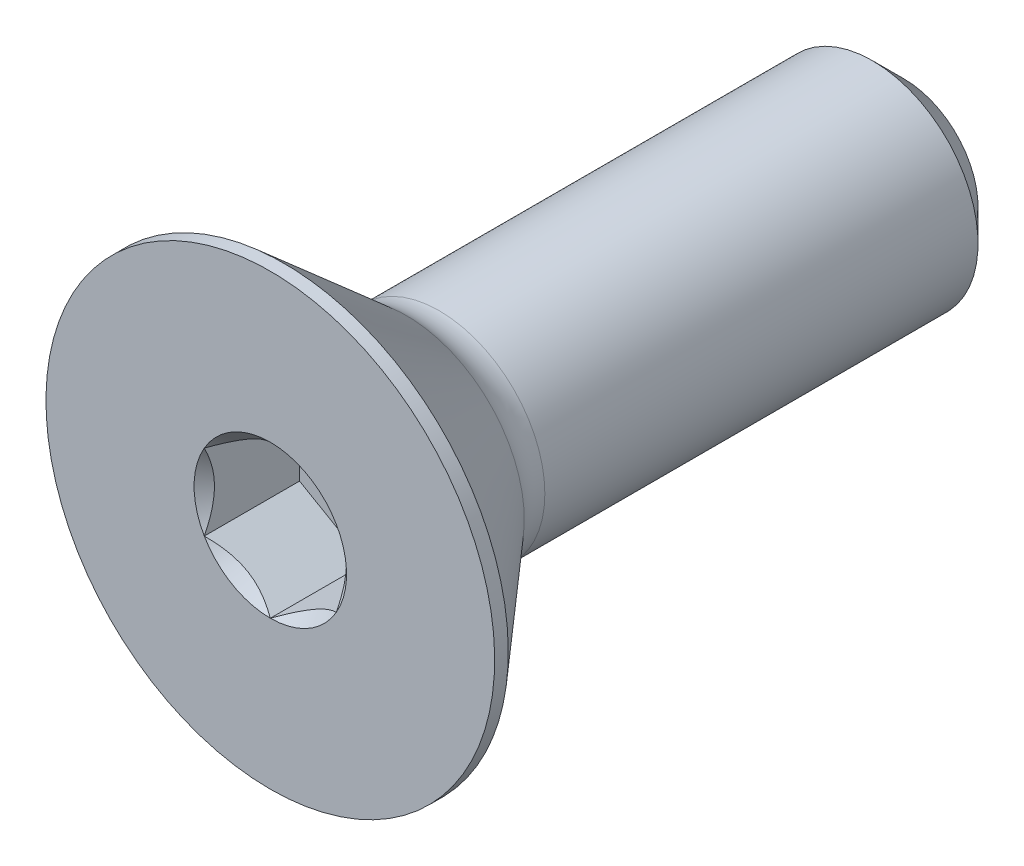
ISO-10303-21;
HEADER;
FILE_DESCRIPTION(('STEP AP214'),'2;1');
FILE_NAME('part.step','',(''),(''),'','','');
FILE_SCHEMA(('AUTOMOTIVE_DESIGN { 1 0 10303 214 1 1 1 1 }'));
ENDSEC;
DATA;
#1=APPLICATION_CONTEXT('core data for automotive mechanical design processes');
#2=APPLICATION_PROTOCOL_DEFINITION('international standard','automotive_design',2000,#1);
#3=PRODUCT_CONTEXT('',#1,'mechanical');
#4=PRODUCT('Part','Part','',(#3));
#5=PRODUCT_RELATED_PRODUCT_CATEGORY('part','',(#4));
#6=PRODUCT_DEFINITION_FORMATION('','',#4);
#7=PRODUCT_DEFINITION_CONTEXT('part definition',#1,'design');
#8=PRODUCT_DEFINITION('design','',#6,#7);
#9=PRODUCT_DEFINITION_SHAPE('','',#8);
#10=(LENGTH_UNIT() NAMED_UNIT(*) SI_UNIT(.MILLI.,.METRE.));
#11=(NAMED_UNIT(*) PLANE_ANGLE_UNIT() SI_UNIT($,.RADIAN.));
#12=(NAMED_UNIT(*) SI_UNIT($,.STERADIAN.) SOLID_ANGLE_UNIT());
#13=UNCERTAINTY_MEASURE_WITH_UNIT(LENGTH_MEASURE(1.E-05),#10,'distance_accuracy_value','');
#14=(GEOMETRIC_REPRESENTATION_CONTEXT(3) GLOBAL_UNCERTAINTY_ASSIGNED_CONTEXT((#13)) GLOBAL_UNIT_ASSIGNED_CONTEXT((#10,
#11,#12)) REPRESENTATION_CONTEXT('',''));
#15=CARTESIAN_POINT('',(0.,0.,0.));
#16=DIRECTION('',(0.,0.,1.));
#17=DIRECTION('',(1.,0.,0.));
#18=AXIS2_PLACEMENT_3D('',#15,#16,#17);
#19=CARTESIAN_POINT('',(0.,0.,0.));
#20=DIRECTION('',(0.,0.,-1.));
#21=DIRECTION('',(0.,1.,0.));
#22=AXIS2_PLACEMENT_3D('',#19,#20,#21);
#23=PLANE('',#22);
#24=CARTESIAN_POINT('',(0.,0.,0.));
#25=DIRECTION('',(0.,0.,1.));
#26=DIRECTION('',(1.,0.,0.));
#27=AXIS2_PLACEMENT_3D('',#24,#25,#26);
#28=CIRCLE('',#27,2.29135888084633);
#29=CARTESIAN_POINT('',(0.,2.29135888084633,0.));
#30=VERTEX_POINT('',#29);
#31=CARTESIAN_POINT('',(-1.984375,1.14567944042316,0.));
#32=VERTEX_POINT('',#31);
#33=EDGE_CURVE('E136',#30,#32,#28,.T.);
#34=ORIENTED_EDGE('',*,*,#33,.F.);
#35=CARTESIAN_POINT('',(1.984375,1.14567944042317,0.));
#36=VERTEX_POINT('',#35);
#37=EDGE_CURVE('E133',#36,#30,#28,.T.);
#38=ORIENTED_EDGE('',*,*,#37,.F.);
#39=CARTESIAN_POINT('',(1.984375,-1.14567944042317,0.));
#40=VERTEX_POINT('',#39);
#41=EDGE_CURVE('E104',#40,#36,#28,.T.);
#42=ORIENTED_EDGE('',*,*,#41,.F.);
#43=CARTESIAN_POINT('',(0.,-2.29135888084633,0.));
#44=VERTEX_POINT('',#43);
#45=EDGE_CURVE('E96',#44,#40,#28,.T.);
#46=ORIENTED_EDGE('',*,*,#45,.F.);
#47=CARTESIAN_POINT('',(-1.984375,-1.14567944042316,0.));
#48=VERTEX_POINT('',#47);
#49=EDGE_CURVE('E57',#48,#44,#28,.T.);
#50=ORIENTED_EDGE('',*,*,#49,.F.);
#51=EDGE_CURVE('E64',#32,#48,#28,.T.);
#52=ORIENTED_EDGE('',*,*,#51,.F.);
#53=EDGE_LOOP('',(#34,#38,#42,#46,#50,#52));
#54=FACE_BOUND('',#53,.T.);
#55=CARTESIAN_POINT('',(0.,0.,0.));
#56=DIRECTION('',(0.,0.,1.));
#57=DIRECTION('',(0.,-1.,0.));
#58=AXIS2_PLACEMENT_3D('',#55,#56,#57);
#59=CIRCLE('',#58,6.7437);
#60=CARTESIAN_POINT('',(0.,-6.7437,0.));
#61=VERTEX_POINT('',#60);
#62=EDGE_CURVE('E178',#61,#61,#59,.T.);
#63=ORIENTED_EDGE('',*,*,#62,.T.);
#64=EDGE_LOOP('',(#63));
#65=FACE_BOUND('',#64,.T.);
#66=ADVANCED_FACE('F38',(#54,#65),#23,.F.);
#67=CARTESIAN_POINT('',(0.,0.,-5.07720440387605));
#68=DIRECTION('',(0.,0.,1.));
#69=DIRECTION('',(0.,-1.,0.));
#70=AXIS2_PLACEMENT_3D('',#67,#68,#69);
#71=TOROIDAL_SURFACE('',#70,4.68066391166966,1.50566391166966);
#72=CARTESIAN_POINT('',(0.,0.,-4.0894));
#73=DIRECTION('',(0.,0.,1.));
#74=DIRECTION('',(0.,-1.,0.));
#75=AXIS2_PLACEMENT_3D('',#72,#73,#74);
#76=CIRCLE('',#75,3.54432493293688);
#77=CARTESIAN_POINT('',(0.,-3.54432493293688,-4.0894));
#78=VERTEX_POINT('',#77);
#79=EDGE_CURVE('E51',#78,#78,#76,.T.);
#80=ORIENTED_EDGE('',*,*,#79,.F.);
#81=EDGE_LOOP('',(#80));
#82=FACE_BOUND('',#81,.T.);
#83=CARTESIAN_POINT('',(0.,0.,-5.07720440387605));
#84=DIRECTION('',(0.,0.,1.));
#85=DIRECTION('',(1.,0.,0.));
#86=AXIS2_PLACEMENT_3D('',#83,#84,#85);
#87=CIRCLE('',#86,3.175);
#88=CARTESIAN_POINT('',(3.175,0.,-5.07720440387605));
#89=VERTEX_POINT('',#88);
#90=EDGE_CURVE('E175',#89,#89,#87,.F.);
#91=ORIENTED_EDGE('',*,*,#90,.F.);
#92=EDGE_LOOP('',(#91));
#93=FACE_BOUND('',#92,.T.);
#94=ADVANCED_FACE('F188',(#82,#93),#71,.F.);
#95=CARTESIAN_POINT('',(0.,0.,-4.0894));
#96=DIRECTION('',(0.,0.,1.));
#97=DIRECTION('',(0.,-1.,0.));
#98=AXIS2_PLACEMENT_3D('',#95,#96,#97);
#99=CONICAL_SURFACE('',#98,3.54432493293688,0.715584993317676);
#100=CARTESIAN_POINT('',(0.,0.,-0.408939999999995));
#101=DIRECTION('',(0.,0.,1.));
#102=DIRECTION('',(0.,-1.,0.));
#103=AXIS2_PLACEMENT_3D('',#100,#101,#102);
#104=CIRCLE('',#103,6.7437);
#105=CARTESIAN_POINT('',(0.,-6.7437,-0.408939999999991));
#106=VERTEX_POINT('',#105);
#107=EDGE_CURVE('E181',#106,#106,#104,.T.);
#108=ORIENTED_EDGE('',*,*,#107,.F.);
#109=EDGE_LOOP('',(#108));
#110=FACE_BOUND('',#109,.T.);
#111=ORIENTED_EDGE('',*,*,#79,.T.);
#112=EDGE_LOOP('',(#111));
#113=FACE_BOUND('',#112,.T.);
#114=ADVANCED_FACE('F186',(#110,#113),#99,.T.);
#115=CARTESIAN_POINT('',(0.,0.,0.));
#116=DIRECTION('',(0.,0.,1.));
#117=DIRECTION('',(0.,-1.,0.));
#118=AXIS2_PLACEMENT_3D('',#115,#116,#117);
#119=CYLINDRICAL_SURFACE('',#118,6.7437);
#120=ORIENTED_EDGE('',*,*,#62,.F.);
#121=EDGE_LOOP('',(#120));
#122=FACE_BOUND('',#121,.T.);
#123=ORIENTED_EDGE('',*,*,#107,.T.);
#124=EDGE_LOOP('',(#123));
#125=FACE_BOUND('',#124,.T.);
#126=ADVANCED_FACE('F207',(#122,#125),#119,.T.);
#127=CARTESIAN_POINT('',(0.,-3.175,-19.05));
#128=DIRECTION('',(0.,0.,-1.));
#129=DIRECTION('',(0.,1.,0.));
#130=AXIS2_PLACEMENT_3D('',#127,#128,#129);
#131=PLANE('',#130);
#132=CARTESIAN_POINT('',(0.,0.,-19.05));
#133=DIRECTION('',(0.,0.,-1.));
#134=DIRECTION('',(0.,1.,0.));
#135=AXIS2_PLACEMENT_3D('',#132,#133,#134);
#136=CIRCLE('',#135,2.22250000000001);
#137=CARTESIAN_POINT('',(0.,2.2225,-19.05));
#138=VERTEX_POINT('',#137);
#139=EDGE_CURVE('E169',#138,#138,#136,.T.);
#140=ORIENTED_EDGE('',*,*,#139,.T.);
#141=EDGE_LOOP('',(#140));
#142=FACE_BOUND('',#141,.T.);
#143=ADVANCED_FACE('F197',(#142),#131,.T.);
#144=CARTESIAN_POINT('',(0.,0.,-19.05));
#145=DIRECTION('',(0.,0.,-1.));
#146=DIRECTION('',(0.,1.,0.));
#147=AXIS2_PLACEMENT_3D('',#144,#145,#146);
#148=CYLINDRICAL_SURFACE('',#147,3.175);
#149=ORIENTED_EDGE('',*,*,#90,.T.);
#150=EDGE_LOOP('',(#149));
#151=FACE_BOUND('',#150,.T.);
#152=CARTESIAN_POINT('',(0.,0.,-18.0975));
#153=DIRECTION('',(0.,0.,-1.));
#154=DIRECTION('',(0.,1.,0.));
#155=AXIS2_PLACEMENT_3D('',#152,#153,#154);
#156=CIRCLE('',#155,3.175);
#157=CARTESIAN_POINT('',(0.,3.175,-18.0975));
#158=VERTEX_POINT('',#157);
#159=EDGE_CURVE('E172',#158,#158,#156,.F.);
#160=ORIENTED_EDGE('',*,*,#159,.T.);
#161=EDGE_LOOP('',(#160));
#162=FACE_BOUND('',#161,.T.);
#163=ADVANCED_FACE('F193',(#151,#162),#148,.T.);
#164=CARTESIAN_POINT('',(0.,0.,-19.05));
#165=DIRECTION('',(0.,0.,1.));
#166=DIRECTION('',(0.,-1.,0.));
#167=AXIS2_PLACEMENT_3D('',#164,#165,#166);
#168=CONICAL_SURFACE('',#167,2.22250000000001,0.785398163397447);
#169=ORIENTED_EDGE('',*,*,#159,.F.);
#170=EDGE_LOOP('',(#169));
#171=FACE_BOUND('',#170,.T.);
#172=ORIENTED_EDGE('',*,*,#139,.F.);
#173=EDGE_LOOP('',(#172));
#174=FACE_BOUND('',#173,.T.);
#175=ADVANCED_FACE('F196',(#171,#174),#168,.T.);
#176=CARTESIAN_POINT('',(0.,0.,0.));
#177=DIRECTION('',(0.,0.,1.));
#178=DIRECTION('',(1.,0.,0.));
#179=AXIS2_PLACEMENT_3D('',#176,#177,#178);
#180=CONICAL_SURFACE('',#179,2.29135888084633,0.78539816339745);
#181=ORIENTED_EDGE('',*,*,#41,.T.);
#182=CARTESIAN_POINT('',(1.984375,-2.28495242191067,0.734984079067574));
#183=CARTESIAN_POINT('',(1.984375,-2.22931635487714,0.692986685792101));
#184=CARTESIAN_POINT('',(1.984375,-2.17336876579766,0.651396054308022));
#185=CARTESIAN_POINT('',(1.984375,-2.06072770287667,0.569208461683915));
#186=CARTESIAN_POINT('',(1.984375,-2.00403404531985,0.528611752607882));
#187=CARTESIAN_POINT('',(1.984375,-1.88936329200117,0.448303503358246));
#188=CARTESIAN_POINT('',(1.984375,-1.83137965544999,0.408601258987222));
#189=CARTESIAN_POINT('',(1.984375,-1.71442802161519,0.33068517355604));
#190=CARTESIAN_POINT('',(1.984375,-1.65546009429911,0.292471227339611));
#191=CARTESIAN_POINT('',(1.984375,-1.47005472325436,0.176252834128706));
#192=CARTESIAN_POINT('',(1.984375,-1.3416390944495,0.101347886967269));
#193=CARTESIAN_POINT('',(1.984375,-1.07840384717678,-0.0356697845027918));
#194=CARTESIAN_POINT('',(1.984375,-0.943607781504099,-0.097825633477414));
#195=CARTESIAN_POINT('',(1.984375,-0.74127510052251,-0.173867421283981));
#196=CARTESIAN_POINT('',(1.984375,-0.676735408966699,-0.195691938646095));
#197=CARTESIAN_POINT('',(1.984375,-0.546098118214577,-0.23415953643492));
#198=CARTESIAN_POINT('',(1.984375,-0.480000412030008,-0.250802259908281));
#199=CARTESIAN_POINT('',(1.984375,-0.347746170154785,-0.277764619108202));
#200=CARTESIAN_POINT('',(1.984375,-0.281612071613337,-0.288192590244967));
#201=CARTESIAN_POINT('',(1.984375,-0.14863662020222,-0.302521852611929));
#202=CARTESIAN_POINT('',(1.984375,-0.081795390896888,-0.306424265765872));
#203=CARTESIAN_POINT('',(1.984375,0.0495156749173034,-0.307412948671392));
#204=CARTESIAN_POINT('',(1.984375,0.113983774924708,-0.304740821135034));
#205=CARTESIAN_POINT('',(1.984375,0.242367515655502,-0.293260789525433));
#206=CARTESIAN_POINT('',(1.984375,0.306283102099375,-0.284452289390649));
#207=CARTESIAN_POINT('',(1.984375,0.434181040054052,-0.261030978711462));
#208=CARTESIAN_POINT('',(1.984375,0.498145026644477,-0.246319393819896));
#209=CARTESIAN_POINT('',(1.984375,0.624675616728325,-0.21187381865527));
#210=CARTESIAN_POINT('',(1.984375,0.687242336669857,-0.192140248625992));
#211=CARTESIAN_POINT('',(1.984375,0.88422548354621,-0.122587762881155));
#212=CARTESIAN_POINT('',(1.984375,1.01583674224241,-0.0648475888892089));
#213=CARTESIAN_POINT('',(1.984375,1.27288659202273,0.0635303363717896));
#214=CARTESIAN_POINT('',(1.984375,1.3983008822619,0.134214424664866));
#215=CARTESIAN_POINT('',(1.984375,1.57956687940503,0.244516663503638));
#216=CARTESIAN_POINT('',(1.984375,1.63738271248117,0.280969829148884));
#217=CARTESIAN_POINT('',(1.984375,1.75202215331741,0.355415962931311));
#218=CARTESIAN_POINT('',(1.984375,1.80884568545336,0.393409047700664));
#219=CARTESIAN_POINT('',(1.984375,1.92116923025136,0.470338808481904));
#220=CARTESIAN_POINT('',(1.984375,1.97667624451606,0.509265312610805));
#221=CARTESIAN_POINT('',(1.984375,2.08693170653472,0.588147745659822));
#222=CARTESIAN_POINT('',(1.984375,2.14168035869581,0.628103388545687));
#223=CARTESIAN_POINT('',(1.984375,2.19611148979895,0.668480610790327));
#224=B_SPLINE_CURVE_WITH_KNOTS('',3,(#182,#183,#184,#185,#186,#187,#188,#189,#190,#191,#192,
#193,#194,#195,#196,#197,#198,#199,#200,#201,#202,#203,#204,#205,#206,#207,#208,#209,#210,#211,
#212,#213,#214,#215,#216,#217,#218,#219,#220,#221,#222,#223),.UNSPECIFIED.,.F.,.F.,(4,2,2,2,2,2,
2,2,2,2,2,2,2,2,2,2,2,2,2,2,4),(0.,0.209126070048127,0.418304637436191,0.629103980098179,
0.83988840153193,1.28549951141298,1.72957750802533,1.93379389781847,2.13802435216272,
2.33858179541699,2.53910475375796,2.7323696342393,2.92565329027999,3.12231577116422,
3.31896180058103,3.74886295246281,4.18033428110719,4.38536017158908,4.59040161968262,
4.7937774913034,4.99709743482716),.UNSPECIFIED.);
#225=EDGE_CURVE('E11',#40,#36,#224,.T.);
#226=ORIENTED_EDGE('',*,*,#225,.F.);
#227=EDGE_LOOP('',(#181,#226));
#228=FACE_BOUND('',#227,.T.);
#229=ADVANCED_FACE('F108',(#228),#180,.F.);
#230=ORIENTED_EDGE('',*,*,#37,.T.);
#231=CARTESIAN_POINT('',(1.984575,1.14556397036933,0.000115478781842512));
#232=CARTESIAN_POINT('',(1.9163590048332,1.18494849354192,-0.0392371477360856));
#233=CARTESIAN_POINT('',(1.84700231489303,1.22499159714897,-0.0762786895538156));
#234=CARTESIAN_POINT('',(1.70557619954781,1.30664400291398,-0.144101141576677));
#235=CARTESIAN_POINT('',(1.63349332126322,1.34826107209555,-0.174844310908246));
#236=CARTESIAN_POINT('',(1.488141602734,1.43217992591557,-0.227508111188786));
#237=CARTESIAN_POINT('',(1.41490978751306,1.47446033414663,-0.249561124120036));
#238=CARTESIAN_POINT('',(1.26683381740529,1.55995203534886,-0.283538507056124));
#239=CARTESIAN_POINT('',(1.19199418724658,1.60316071596705,-0.295488243908272));
#240=CARTESIAN_POINT('',(1.06301458545619,1.6776271237807,-0.306269900918094));
#241=CARTESIAN_POINT('',(1.00904128422756,1.7087886237741,-0.30786610094093));
#242=CARTESIAN_POINT('',(0.901182881480201,1.77106070163465,-0.305178161134707));
#243=CARTESIAN_POINT('',(0.847297817514478,1.80217125782056,-0.300891959659541));
#244=CARTESIAN_POINT('',(0.740036461751397,1.86409863044402,-0.286683126986481));
#245=CARTESIAN_POINT('',(0.686660807239861,1.89491507894443,-0.276754189547728));
#246=CARTESIAN_POINT('',(0.580832482591105,1.95601509066827,-0.251804915725462));
#247=CARTESIAN_POINT('',(0.5283797420289,1.9862986945516,-0.236784969610512));
#248=CARTESIAN_POINT('',(0.394017661036352,2.06387267818152,-0.192192148364331));
#249=CARTESIAN_POINT('',(0.312941642841677,2.11068193911104,-0.159257004061667));
#250=CARTESIAN_POINT('',(0.193726693270161,2.17951072233758,-0.103657558797803));
#251=CARTESIAN_POINT('',(0.154440075614,2.20219286161692,-0.0841224079481376));
#252=CARTESIAN_POINT('',(0.0765946381319478,2.24713694590237,-0.0432712618805985));
#253=CARTESIAN_POINT('',(0.0380353888983019,2.26939913882716,-0.0219563604316496));
#254=CARTESIAN_POINT('',(-0.00019999999999949,2.29147435090017,0.000115478781842944));
#255=B_SPLINE_CURVE_WITH_KNOTS('',3,(#231,#232,#233,#234,#235,#236,#237,#238,#239,#240,#241,
#242,#243,#244,#245,#246,#247,#248,#249,#250,#251,#252,#253,#254),.UNSPECIFIED.,.F.,.F.,(4,2,2,
2,2,2,2,2,2,2,2,4),(0.,0.264339630306626,0.530219665093693,0.791876416371459,1.05287424418109,
1.239639843932,1.42647091743852,1.61351120244034,1.8005371524754,2.09764209964316,
2.24579179873713,2.39385111134157),.UNSPECIFIED.);
#256=EDGE_CURVE('E135',#36,#30,#255,.T.);
#257=ORIENTED_EDGE('',*,*,#256,.F.);
#258=EDGE_LOOP('',(#230,#257));
#259=FACE_BOUND('',#258,.T.);
#260=ADVANCED_FACE('F319',(#259),#180,.F.);
#261=ORIENTED_EDGE('',*,*,#33,.T.);
#262=CARTESIAN_POINT('',(0.000200000000000514,2.29147435090017,0.000115478781843248));
#263=CARTESIAN_POINT('',(-0.0680159951668021,2.25208982772757,-0.0392371477360846));
#264=CARTESIAN_POINT('',(-0.137372685106965,2.21204672412052,-0.0762786895538146));
#265=CARTESIAN_POINT('',(-0.278798800452187,2.13039431835551,-0.144101141576676));
#266=CARTESIAN_POINT('',(-0.350881678736782,2.08877724917394,-0.174844310908246));
#267=CARTESIAN_POINT('',(-0.496233397266003,2.00485839535392,-0.227508111188786));
#268=CARTESIAN_POINT('',(-0.569465212486937,1.96257798712287,-0.249561124120036));
#269=CARTESIAN_POINT('',(-0.717541182594705,1.87708628592063,-0.283538507056124));
#270=CARTESIAN_POINT('',(-0.792380812753423,1.83387760530244,-0.295488243908272));
#271=CARTESIAN_POINT('',(-0.921360414543814,1.75941119748879,-0.306269900918094));
#272=CARTESIAN_POINT('',(-0.975333715772441,1.72824969749539,-0.30786610094093));
#273=CARTESIAN_POINT('',(-1.0831921185198,1.66597761963484,-0.305178161134708));
#274=CARTESIAN_POINT('',(-1.13707718248552,1.63486706344893,-0.300891959659541));
#275=CARTESIAN_POINT('',(-1.2443385382486,1.57293969082547,-0.286683126986481));
#276=CARTESIAN_POINT('',(-1.29771419276014,1.54212324232506,-0.276754189547728));
#277=CARTESIAN_POINT('',(-1.4035425174089,1.48102323060122,-0.251804915725462));
#278=CARTESIAN_POINT('',(-1.4559952579711,1.45073962671789,-0.236784969610512));
#279=CARTESIAN_POINT('',(-1.59035733896365,1.37316564308797,-0.192192148364331));
#280=CARTESIAN_POINT('',(-1.67143335715832,1.32635638215845,-0.159257004061668));
#281=CARTESIAN_POINT('',(-1.79064830672984,1.25752759893191,-0.103657558797803));
#282=CARTESIAN_POINT('',(-1.829934924386,1.23484545965257,-0.0841224079481375));
#283=CARTESIAN_POINT('',(-1.90778036186805,1.18990137536713,-0.0432712618805979));
#284=CARTESIAN_POINT('',(-1.9463396111017,1.16763918244233,-0.021956360431649));
#285=CARTESIAN_POINT('',(-1.984575,1.14556397036933,0.000115478781843357));
#286=B_SPLINE_CURVE_WITH_KNOTS('',3,(#262,#263,#264,#265,#266,#267,#268,#269,#270,#271,#272,
#273,#274,#275,#276,#277,#278,#279,#280,#281,#282,#283,#284,#285),.UNSPECIFIED.,.F.,.F.,(4,2,2,
2,2,2,2,2,2,2,2,4),(0.,0.264339630306626,0.530219665093694,0.79187641637146,1.05287424418109,
1.239639843932,1.42647091743852,1.61351120244035,1.8005371524754,2.09764209964316,
2.24579179873714,2.39385111134157),.UNSPECIFIED.);
#287=EDGE_CURVE('E139',#30,#32,#286,.T.);
#288=ORIENTED_EDGE('',*,*,#287,.F.);
#289=EDGE_LOOP('',(#261,#288));
#290=FACE_BOUND('',#289,.T.);
#291=ADVANCED_FACE('F142',(#290),#180,.F.);
#292=ORIENTED_EDGE('',*,*,#51,.T.);
#293=CARTESIAN_POINT('',(-1.984375,-2.28495242157822,0.734984078816568));
#294=CARTESIAN_POINT('',(-1.984375,-2.22931635455402,0.692986685550762));
#295=CARTESIAN_POINT('',(-1.984375,-2.17336876548389,0.651396054076336));
#296=CARTESIAN_POINT('',(-1.984375,-2.06072770258171,0.569208461471479));
#297=CARTESIAN_POINT('',(-1.984375,-2.00403404503435,0.528611752405043));
#298=CARTESIAN_POINT('',(-1.984375,-1.88936329173488,0.448303503174669));
#299=CARTESIAN_POINT('',(-1.984375,-1.83137965519348,0.408601258813307));
#300=CARTESIAN_POINT('',(-1.984375,-1.7144280213784,0.330685173401292));
#301=CARTESIAN_POINT('',(-1.984375,-1.65546009407227,0.292471227194368));
#302=CARTESIAN_POINT('',(-1.984375,-1.47005472306035,0.176252834013636));
#303=CARTESIAN_POINT('',(-1.984375,-1.34163909427883,0.101347886872382));
#304=CARTESIAN_POINT('',(-1.984375,-1.0784038470548,-0.0356697845602621));
#305=CARTESIAN_POINT('',(-1.984375,-0.943607781407424,-0.097825633517625));
#306=CARTESIAN_POINT('',(-1.984375,-0.741275100444882,-0.173867421311381));
#307=CARTESIAN_POINT('',(-1.984375,-0.676735408881095,-0.195691938673995));
#308=CARTESIAN_POINT('',(-1.984375,-0.546098118112762,-0.234159536462205));
#309=CARTESIAN_POINT('',(-1.984375,-0.480000411919956,-0.250802259934451));
#310=CARTESIAN_POINT('',(-1.984375,-0.347746170028532,-0.277764619130277));
#311=CARTESIAN_POINT('',(-1.984375,-0.281612071479123,-0.288192590264108));
#312=CARTESIAN_POINT('',(-1.984375,-0.14863662005235,-0.302521852623404));
#313=CARTESIAN_POINT('',(-1.984375,-0.0817953907393236,-0.306424265772614));
#314=CARTESIAN_POINT('',(-1.984375,0.0495156750890645,-0.307412948667327));
#315=CARTESIAN_POINT('',(-1.984375,0.113983775102992,-0.304740821124985));
#316=CARTESIAN_POINT('',(-1.984375,0.242367515846177,-0.293260789502484));
#317=CARTESIAN_POINT('',(-1.984375,0.30628310229592,-0.284452289360785));
#318=CARTESIAN_POINT('',(-1.984375,0.434181040262184,-0.261030978667102));
#319=CARTESIAN_POINT('',(-1.984375,0.498145026858309,-0.246319393767914));
#320=CARTESIAN_POINT('',(-1.984375,0.624675616953007,-0.211873818587873));
#321=CARTESIAN_POINT('',(-1.984375,0.687242336899689,-0.192140248550804));
#322=CARTESIAN_POINT('',(-1.984375,0.884225483826088,-0.12258776276924));
#323=CARTESIAN_POINT('',(-1.984375,1.01583674256468,-0.0648475887435029));
#324=CARTESIAN_POINT('',(-1.984375,1.27288659242652,0.0635303365887984));
#325=CARTESIAN_POINT('',(-1.984375,1.3983008827048,0.134214424919413));
#326=CARTESIAN_POINT('',(-1.984375,1.57956687990221,0.244516663813199));
#327=CARTESIAN_POINT('',(-1.984375,1.63738271299424,0.280969829475364));
#328=CARTESIAN_POINT('',(-1.984375,1.75202215386202,0.355415963291705));
#329=CARTESIAN_POINT('',(-1.984375,1.80884568601362,0.393409048078054));
#330=CARTESIAN_POINT('',(-1.984375,1.92116923084255,0.470338808893091));
#331=CARTESIAN_POINT('',(-1.984375,1.97667624512253,0.509265313038791));
#332=CARTESIAN_POINT('',(-1.984375,2.08693170717166,0.588147746121386));
#333=CARTESIAN_POINT('',(-1.984375,2.14168035934793,0.62810338902403));
#334=CARTESIAN_POINT('',(-1.984375,2.19611149046622,0.668480611285426));
#335=B_SPLINE_CURVE_WITH_KNOTS('',3,(#293,#294,#295,#296,#297,#298,#299,#300,#301,#302,#303,
#304,#305,#306,#307,#308,#309,#310,#311,#312,#313,#314,#315,#316,#317,#318,#319,#320,#321,#322,
#323,#324,#325,#326,#327,#328,#329,#330,#331,#332,#333,#334),.UNSPECIFIED.,.F.,.F.,(4,2,2,2,2,2,
2,2,2,2,2,2,2,2,2,2,2,2,2,2,4),(0.,0.209126070008322,0.418304637356569,0.629103979977993,
0.839888401371185,1.28549951116127,1.72957750768351,1.93379389749971,2.13802435186698,
2.33858179514333,2.53910475350639,2.73236963400794,2.92565329006887,3.12231577097487,
3.31896180041345,3.74886295245172,4.18033428125362,4.3853601718029,4.59040161996383,
4.79377749165108,4.99709743524131),.UNSPECIFIED.);
#336=EDGE_CURVE('E145',#32,#48,#335,.F.);
#337=ORIENTED_EDGE('',*,*,#336,.F.);
#338=EDGE_LOOP('',(#292,#337));
#339=FACE_BOUND('',#338,.T.);
#340=ADVANCED_FACE('F146',(#339),#180,.F.);
#341=ORIENTED_EDGE('',*,*,#49,.T.);
#342=CARTESIAN_POINT('',(-1.984575,-1.14556397036933,0.000115478781843379));
#343=CARTESIAN_POINT('',(-1.9163590048332,-1.18494849354192,-0.0392371477360847));
#344=CARTESIAN_POINT('',(-1.84700231489303,-1.22499159714897,-0.0762786895538149));
#345=CARTESIAN_POINT('',(-1.70557619954781,-1.30664400291398,-0.144101141576677));
#346=CARTESIAN_POINT('',(-1.63349332126322,-1.34826107209555,-0.174844310908246));
#347=CARTESIAN_POINT('',(-1.488141602734,-1.43217992591557,-0.227508111188786));
#348=CARTESIAN_POINT('',(-1.41490978751306,-1.47446033414662,-0.249561124120036));
#349=CARTESIAN_POINT('',(-1.26683381740529,-1.55995203534886,-0.283538507056124));
#350=CARTESIAN_POINT('',(-1.19199418724658,-1.60316071596705,-0.295488243908271));
#351=CARTESIAN_POINT('',(-1.06301458545618,-1.6776271237807,-0.306269900918094));
#352=CARTESIAN_POINT('',(-1.00904128422756,-1.7087886237741,-0.30786610094093));
#353=CARTESIAN_POINT('',(-0.9011828814802,-1.77106070163465,-0.305178161134708));
#354=CARTESIAN_POINT('',(-0.847297817514477,-1.80217125782056,-0.300891959659541));
#355=CARTESIAN_POINT('',(-0.740036461751396,-1.86409863044402,-0.286683126986481));
#356=CARTESIAN_POINT('',(-0.68666080723986,-1.89491507894443,-0.276754189547727));
#357=CARTESIAN_POINT('',(-0.580832482591104,-1.95601509066828,-0.251804915725462));
#358=CARTESIAN_POINT('',(-0.528379742028899,-1.9862986945516,-0.236784969610512));
#359=CARTESIAN_POINT('',(-0.394017661036352,-2.06387267818152,-0.19219214836433));
#360=CARTESIAN_POINT('',(-0.312941642841676,-2.11068193911104,-0.159257004061667));
#361=CARTESIAN_POINT('',(-0.193726693270161,-2.17951072233758,-0.103657558797803));
#362=CARTESIAN_POINT('',(-0.154440075614,-2.20219286161692,-0.0841224079481376));
#363=CARTESIAN_POINT('',(-0.0765946381319478,-2.24713694590237,-0.0432712618805984));
#364=CARTESIAN_POINT('',(-0.038035388898302,-2.26939913882716,-0.0219563604316496));
#365=CARTESIAN_POINT('',(0.000199999999999381,-2.29147435090017,0.000115478781842758));
#366=B_SPLINE_CURVE_WITH_KNOTS('',3,(#342,#343,#344,#345,#346,#347,#348,#349,#350,#351,#352,
#353,#354,#355,#356,#357,#358,#359,#360,#361,#362,#363,#364,#365),.UNSPECIFIED.,.F.,.F.,(4,2,2,
2,2,2,2,2,2,2,2,4),(0.,0.264339630306627,0.530219665093694,0.79187641637146,1.05287424418109,
1.239639843932,1.42647091743852,1.61351120244035,1.8005371524754,2.09764209964316,
2.24579179873714,2.39385111134157),.UNSPECIFIED.);
#367=EDGE_CURVE('E120',#48,#44,#366,.T.);
#368=ORIENTED_EDGE('',*,*,#367,.F.);
#369=EDGE_LOOP('',(#341,#368));
#370=FACE_BOUND('',#369,.T.);
#371=ADVANCED_FACE('F338',(#370),#180,.F.);
#372=ORIENTED_EDGE('',*,*,#45,.T.);
#373=CARTESIAN_POINT('',(-0.000200000000000887,-2.29147435090017,0.000115478781843248));
#374=CARTESIAN_POINT('',(0.0680159951668016,-2.25208982772757,-0.0392371477360851));
#375=CARTESIAN_POINT('',(0.137372685106965,-2.21204672412052,-0.0762786895538152));
#376=CARTESIAN_POINT('',(0.278798800452187,-2.13039431835551,-0.144101141576677));
#377=CARTESIAN_POINT('',(0.350881678736782,-2.08877724917394,-0.174844310908247));
#378=CARTESIAN_POINT('',(0.496233397266004,-2.00485839535392,-0.227508111188787));
#379=CARTESIAN_POINT('',(0.569465212486938,-1.96257798712287,-0.249561124120036));
#380=CARTESIAN_POINT('',(0.717541182594706,-1.87708628592063,-0.283538507056124));
#381=CARTESIAN_POINT('',(0.792380812753425,-1.83387760530244,-0.295488243908272));
#382=CARTESIAN_POINT('',(0.921360414543816,-1.75941119748879,-0.306269900918094));
#383=CARTESIAN_POINT('',(0.975333715772442,-1.72824969749539,-0.30786610094093));
#384=CARTESIAN_POINT('',(1.0831921185198,-1.66597761963484,-0.305178161134708));
#385=CARTESIAN_POINT('',(1.13707718248552,-1.63486706344893,-0.300891959659541));
#386=CARTESIAN_POINT('',(1.2443385382486,-1.57293969082547,-0.286683126986481));
#387=CARTESIAN_POINT('',(1.29771419276014,-1.54212324232506,-0.276754189547727));
#388=CARTESIAN_POINT('',(1.4035425174089,-1.48102323060122,-0.251804915725461));
#389=CARTESIAN_POINT('',(1.4559952579711,-1.45073962671789,-0.236784969610511));
#390=CARTESIAN_POINT('',(1.59035733896365,-1.37316564308797,-0.19219214836433));
#391=CARTESIAN_POINT('',(1.67143335715832,-1.32635638215845,-0.159257004061667));
#392=CARTESIAN_POINT('',(1.79064830672984,-1.25752759893191,-0.103657558797803));
#393=CARTESIAN_POINT('',(1.829934924386,-1.23484545965257,-0.0841224079481372));
#394=CARTESIAN_POINT('',(1.90778036186805,-1.18990137536713,-0.043271261880598));
#395=CARTESIAN_POINT('',(1.9463396111017,-1.16763918244233,-0.0219563604316492));
#396=CARTESIAN_POINT('',(1.984575,-1.14556397036933,0.000115478781842937));
#397=B_SPLINE_CURVE_WITH_KNOTS('',3,(#373,#374,#375,#376,#377,#378,#379,#380,#381,#382,#383,
#384,#385,#386,#387,#388,#389,#390,#391,#392,#393,#394,#395,#396),.UNSPECIFIED.,.F.,.F.,(4,2,2,
2,2,2,2,2,2,2,2,4),(0.,0.264339630306627,0.530219665093695,0.791876416371461,1.05287424418109,
1.239639843932,1.42647091743852,1.61351120244035,1.8005371524754,2.09764209964316,
2.24579179873714,2.39385111134157),.UNSPECIFIED.);
#398=EDGE_CURVE('E100',#44,#40,#397,.T.);
#399=ORIENTED_EDGE('',*,*,#398,.F.);
#400=EDGE_LOOP('',(#372,#399));
#401=FACE_BOUND('',#400,.T.);
#402=ADVANCED_FACE('F98',(#401),#180,.F.);
#403=CARTESIAN_POINT('',(1.984375,-1.14567944042316,-2.86258));
#404=DIRECTION('',(0.,0.,1.));
#405=DIRECTION('',(1.,0.,0.));
#406=AXIS2_PLACEMENT_3D('',#403,#404,#405);
#407=PLANE('',#406);
#408=DIRECTION('',(0.866025403784439,0.5,0.));
#409=VECTOR('',#408,1.);
#410=CARTESIAN_POINT('',(0.,-2.29135888084633,-2.86258));
#411=LINE('',#410,#409);
#412=CARTESIAN_POINT('',(0.,-2.29135888084633,-2.86258));
#413=VERTEX_POINT('',#412);
#414=CARTESIAN_POINT('',(1.984375,-1.14567944042316,-2.86258));
#415=VERTEX_POINT('',#414);
#416=EDGE_CURVE('E119',#413,#415,#411,.T.);
#417=ORIENTED_EDGE('',*,*,#416,.T.);
#418=DIRECTION('',(0.,1.,0.));
#419=VECTOR('',#418,1.);
#420=CARTESIAN_POINT('',(1.984375,-1.14567944042316,-2.86258));
#421=LINE('',#420,#419);
#422=CARTESIAN_POINT('',(1.984375,1.14567944042316,-2.86258));
#423=VERTEX_POINT('',#422);
#424=EDGE_CURVE('E124',#415,#423,#421,.T.);
#425=ORIENTED_EDGE('',*,*,#424,.T.);
#426=DIRECTION('',(-0.866025403784439,0.5,0.));
#427=VECTOR('',#426,1.);
#428=CARTESIAN_POINT('',(1.984375,1.14567944042316,-2.86258));
#429=LINE('',#428,#427);
#430=CARTESIAN_POINT('',(0.,2.29135888084633,-2.86258));
#431=VERTEX_POINT('',#430);
#432=EDGE_CURVE('E401',#423,#431,#429,.T.);
#433=ORIENTED_EDGE('',*,*,#432,.T.);
#434=DIRECTION('',(-0.866025403784439,-0.5,0.));
#435=VECTOR('',#434,1.);
#436=CARTESIAN_POINT('',(0.,2.29135888084633,-2.86258));
#437=LINE('',#436,#435);
#438=CARTESIAN_POINT('',(-1.984375,1.14567944042316,-2.86258));
#439=VERTEX_POINT('',#438);
#440=EDGE_CURVE('E404',#431,#439,#437,.T.);
#441=ORIENTED_EDGE('',*,*,#440,.T.);
#442=DIRECTION('',(0.,-1.,0.));
#443=VECTOR('',#442,1.);
#444=CARTESIAN_POINT('',(-1.984375,1.14567944042316,-2.86258));
#445=LINE('',#444,#443);
#446=CARTESIAN_POINT('',(-1.984375,-1.14567944042316,-2.86258));
#447=VERTEX_POINT('',#446);
#448=EDGE_CURVE('E160',#439,#447,#445,.T.);
#449=ORIENTED_EDGE('',*,*,#448,.T.);
#450=DIRECTION('',(0.866025403784438,-0.5,0.));
#451=VECTOR('',#450,1.);
#452=CARTESIAN_POINT('',(-1.984375,-1.14567944042316,-2.86258));
#453=LINE('',#452,#451);
#454=EDGE_CURVE('E127',#447,#413,#453,.T.);
#455=ORIENTED_EDGE('',*,*,#454,.T.);
#456=EDGE_LOOP('',(#417,#425,#433,#441,#449,#455));
#457=FACE_BOUND('',#456,.T.);
#458=ADVANCED_FACE('F305',(#457),#407,.T.);
#459=CARTESIAN_POINT('',(1.984375,-1.14567944042316,-2.86258));
#460=DIRECTION('',(1.,0.,0.));
#461=DIRECTION('',(0.,1.,0.));
#462=AXIS2_PLACEMENT_3D('',#459,#460,#461);
#463=PLANE('',#462);
#464=DIRECTION('',(0.,0.,1.));
#465=VECTOR('',#464,1.);
#466=CARTESIAN_POINT('',(1.984375,-1.14567944042316,-2.86258));
#467=LINE('',#466,#465);
#468=EDGE_CURVE('E116',#415,#40,#467,.T.);
#469=ORIENTED_EDGE('',*,*,#468,.T.);
#470=ORIENTED_EDGE('',*,*,#225,.T.);
#471=DIRECTION('',(0.,0.,1.));
#472=VECTOR('',#471,1.);
#473=CARTESIAN_POINT('',(1.984375,1.14567944042316,-2.86258));
#474=LINE('',#473,#472);
#475=EDGE_CURVE('E126',#423,#36,#474,.T.);
#476=ORIENTED_EDGE('',*,*,#475,.F.);
#477=ORIENTED_EDGE('',*,*,#424,.F.);
#478=EDGE_LOOP('',(#469,#470,#476,#477));
#479=FACE_BOUND('',#478,.T.);
#480=ADVANCED_FACE('F122',(#479),#463,.F.);
#481=CARTESIAN_POINT('',(1.984375,1.14567944042316,-2.86258));
#482=DIRECTION('',(0.5,0.866025403784439,0.));
#483=DIRECTION('',(-0.866025403784439,0.5,0.));
#484=AXIS2_PLACEMENT_3D('',#481,#482,#483);
#485=PLANE('',#484);
#486=ORIENTED_EDGE('',*,*,#475,.T.);
#487=ORIENTED_EDGE('',*,*,#256,.T.);
#488=DIRECTION('',(0.,0.,1.));
#489=VECTOR('',#488,1.);
#490=CARTESIAN_POINT('',(0.,2.29135888084633,-2.86258));
#491=LINE('',#490,#489);
#492=EDGE_CURVE('E156',#431,#30,#491,.T.);
#493=ORIENTED_EDGE('',*,*,#492,.F.);
#494=ORIENTED_EDGE('',*,*,#432,.F.);
#495=EDGE_LOOP('',(#486,#487,#493,#494));
#496=FACE_BOUND('',#495,.T.);
#497=ADVANCED_FACE('F289',(#496),#485,.F.);
#498=CARTESIAN_POINT('',(0.,2.29135888084633,-2.86258));
#499=DIRECTION('',(-0.5,0.866025403784439,0.));
#500=DIRECTION('',(-0.866025403784439,-0.5,0.));
#501=AXIS2_PLACEMENT_3D('',#498,#499,#500);
#502=PLANE('',#501);
#503=ORIENTED_EDGE('',*,*,#492,.T.);
#504=ORIENTED_EDGE('',*,*,#287,.T.);
#505=DIRECTION('',(0.,0.,1.));
#506=VECTOR('',#505,1.);
#507=CARTESIAN_POINT('',(-1.984375,1.14567944042316,-2.86258));
#508=LINE('',#507,#506);
#509=EDGE_CURVE('E154',#439,#32,#508,.T.);
#510=ORIENTED_EDGE('',*,*,#509,.F.);
#511=ORIENTED_EDGE('',*,*,#440,.F.);
#512=EDGE_LOOP('',(#503,#504,#510,#511));
#513=FACE_BOUND('',#512,.T.);
#514=ADVANCED_FACE('F152',(#513),#502,.F.);
#515=CARTESIAN_POINT('',(-1.984375,1.14567944042316,-2.86258));
#516=DIRECTION('',(-1.,0.,0.));
#517=DIRECTION('',(0.,0.,1.));
#518=AXIS2_PLACEMENT_3D('',#515,#516,#517);
#519=PLANE('',#518);
#520=ORIENTED_EDGE('',*,*,#509,.T.);
#521=ORIENTED_EDGE('',*,*,#336,.T.);
#522=DIRECTION('',(0.,0.,1.));
#523=VECTOR('',#522,1.);
#524=CARTESIAN_POINT('',(-1.984375,-1.14567944042316,-2.86258));
#525=LINE('',#524,#523);
#526=EDGE_CURVE('E162',#447,#48,#525,.T.);
#527=ORIENTED_EDGE('',*,*,#526,.F.);
#528=ORIENTED_EDGE('',*,*,#448,.F.);
#529=EDGE_LOOP('',(#520,#521,#527,#528));
#530=FACE_BOUND('',#529,.T.);
#531=ADVANCED_FACE('F158',(#530),#519,.F.);
#532=CARTESIAN_POINT('',(-1.984375,-1.14567944042316,-2.86258));
#533=DIRECTION('',(-0.5,-0.866025403784438,0.));
#534=DIRECTION('',(0.866025403784439,-0.5,0.));
#535=AXIS2_PLACEMENT_3D('',#532,#533,#534);
#536=PLANE('',#535);
#537=ORIENTED_EDGE('',*,*,#526,.T.);
#538=ORIENTED_EDGE('',*,*,#367,.T.);
#539=DIRECTION('',(0.,0.,1.));
#540=VECTOR('',#539,1.);
#541=CARTESIAN_POINT('',(0.,-2.29135888084633,-2.86258));
#542=LINE('',#541,#540);
#543=EDGE_CURVE('E118',#413,#44,#542,.T.);
#544=ORIENTED_EDGE('',*,*,#543,.F.);
#545=ORIENTED_EDGE('',*,*,#454,.F.);
#546=EDGE_LOOP('',(#537,#538,#544,#545));
#547=FACE_BOUND('',#546,.T.);
#548=ADVANCED_FACE('F266',(#547),#536,.F.);
#549=CARTESIAN_POINT('',(0.,-2.29135888084633,-2.86258));
#550=DIRECTION('',(0.5,-0.866025403784439,0.));
#551=DIRECTION('',(0.866025403784439,0.5,0.));
#552=AXIS2_PLACEMENT_3D('',#549,#550,#551);
#553=PLANE('',#552);
#554=ORIENTED_EDGE('',*,*,#543,.T.);
#555=ORIENTED_EDGE('',*,*,#398,.T.);
#556=ORIENTED_EDGE('',*,*,#468,.F.);
#557=ORIENTED_EDGE('',*,*,#416,.F.);
#558=EDGE_LOOP('',(#554,#555,#556,#557));
#559=FACE_BOUND('',#558,.T.);
#560=ADVANCED_FACE('F114',(#559),#553,.F.);
#561=CLOSED_SHELL('',(#66,#94,#114,#126,#143,#163,#175,#229,#260,#291,#340,#371,#402,#458,#480,
#497,#514,#531,#548,#560));
#562=MANIFOLD_SOLID_BREP('B2',#561);
#563=ADVANCED_BREP_SHAPE_REPRESENTATION('',(#18,#562),#14);
#564=SHAPE_DEFINITION_REPRESENTATION(#9,#563);
ENDSEC;
END-ISO-10303-21;
